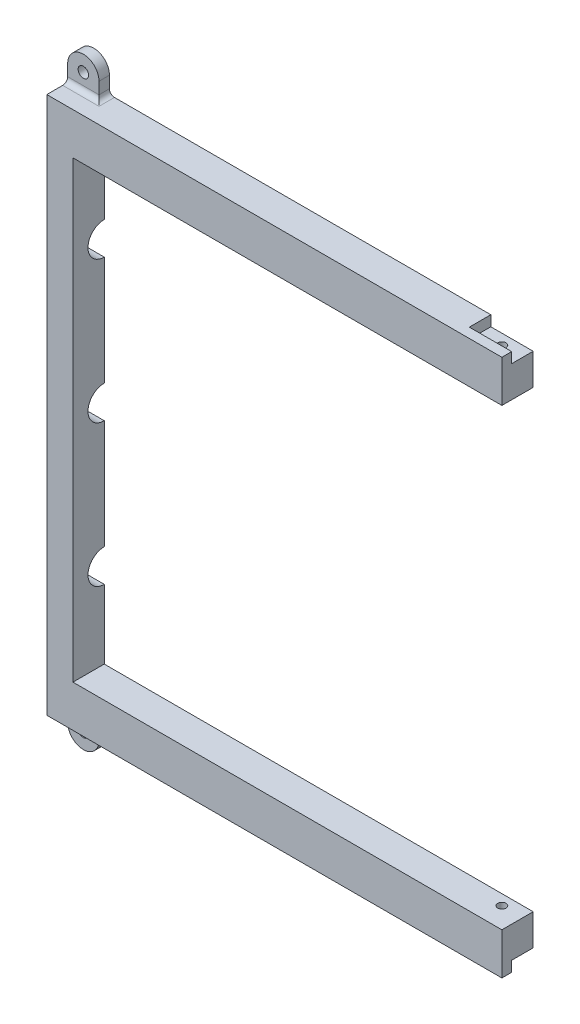
ISO-10303-21;
HEADER;
FILE_DESCRIPTION(('STEP AP214'),'2;1');
FILE_NAME('part.step','',(''),(''),'','','');
FILE_SCHEMA(('AUTOMOTIVE_DESIGN { 1 0 10303 214 1 1 1 1 }'));
ENDSEC;
DATA;
#1=APPLICATION_CONTEXT('core data for automotive mechanical design processes');
#2=APPLICATION_PROTOCOL_DEFINITION('international standard','automotive_design',2000,#1);
#3=PRODUCT_CONTEXT('',#1,'mechanical');
#4=PRODUCT('Part','Part','',(#3));
#5=PRODUCT_RELATED_PRODUCT_CATEGORY('part','',(#4));
#6=PRODUCT_DEFINITION_FORMATION('','',#4);
#7=PRODUCT_DEFINITION_CONTEXT('part definition',#1,'design');
#8=PRODUCT_DEFINITION('design','',#6,#7);
#9=PRODUCT_DEFINITION_SHAPE('','',#8);
#10=(LENGTH_UNIT() NAMED_UNIT(*) SI_UNIT(.MILLI.,.METRE.));
#11=(NAMED_UNIT(*) PLANE_ANGLE_UNIT() SI_UNIT($,.RADIAN.));
#12=(NAMED_UNIT(*) SI_UNIT($,.STERADIAN.) SOLID_ANGLE_UNIT());
#13=UNCERTAINTY_MEASURE_WITH_UNIT(LENGTH_MEASURE(1.E-05),#10,'distance_accuracy_value','');
#14=(GEOMETRIC_REPRESENTATION_CONTEXT(3) GLOBAL_UNCERTAINTY_ASSIGNED_CONTEXT((#13)) GLOBAL_UNIT_ASSIGNED_CONTEXT((#10,
#11,#12)) REPRESENTATION_CONTEXT('',''));
#15=CARTESIAN_POINT('',(0.,0.,0.));
#16=DIRECTION('',(0.,0.,1.));
#17=DIRECTION('',(1.,0.,0.));
#18=AXIS2_PLACEMENT_3D('',#15,#16,#17);
#19=CARTESIAN_POINT('',(-138.43,-81.7626,9.525));
#20=DIRECTION('',(0.,1.,0.));
#21=DIRECTION('',(0.,0.,1.));
#22=AXIS2_PLACEMENT_3D('',#19,#20,#21);
#23=PLANE('',#22);
#24=DIRECTION('',(1.,0.,0.));
#25=VECTOR('',#24,1.);
#26=CARTESIAN_POINT('',(-12.8905,-81.7626,6.5405));
#27=LINE('',#26,#25);
#28=CARTESIAN_POINT('',(-12.8905,-81.7626,6.5405));
#29=VERTEX_POINT('',#28);
#30=CARTESIAN_POINT('',(0.,-81.7626,6.5405));
#31=VERTEX_POINT('',#30);
#32=EDGE_CURVE('E462',#29,#31,#27,.T.);
#33=ORIENTED_EDGE('',*,*,#32,.T.);
#34=DIRECTION('',(0.,0.,1.));
#35=VECTOR('',#34,1.);
#36=CARTESIAN_POINT('',(0.,-81.7626,9.525));
#37=LINE('',#36,#35);
#38=CARTESIAN_POINT('',(0.,-81.7626,9.525));
#39=VERTEX_POINT('',#38);
#40=EDGE_CURVE('E446',#31,#39,#37,.T.);
#41=ORIENTED_EDGE('',*,*,#40,.T.);
#42=DIRECTION('',(1.,0.,0.));
#43=VECTOR('',#42,1.);
#44=CARTESIAN_POINT('',(-138.43,-81.7626,9.525));
#45=LINE('',#44,#43);
#46=CARTESIAN_POINT('',(-138.43,-81.7626,9.525));
#47=VERTEX_POINT('',#46);
#48=EDGE_CURVE('E274',#47,#39,#45,.T.);
#49=ORIENTED_EDGE('',*,*,#48,.F.);
#50=DIRECTION('',(0.,0.,-1.));
#51=VECTOR('',#50,1.);
#52=CARTESIAN_POINT('',(-138.43,-81.7626,9.525));
#53=LINE('',#52,#51);
#54=CARTESIAN_POINT('',(-138.43,-81.7626,4.699));
#55=VERTEX_POINT('',#54);
#56=EDGE_CURVE('E291',#47,#55,#53,.T.);
#57=ORIENTED_EDGE('',*,*,#56,.T.);
#58=DIRECTION('',(1.,0.,0.));
#59=VECTOR('',#58,1.);
#60=CARTESIAN_POINT('',(-138.43,-81.7626,4.699));
#61=LINE('',#60,#59);
#62=CARTESIAN_POINT('',(-127.381,-81.7626,4.699));
#63=VERTEX_POINT('',#62);
#64=EDGE_CURVE('E307',#55,#63,#61,.T.);
#65=ORIENTED_EDGE('',*,*,#64,.T.);
#66=DIRECTION('',(0.,0.,-1.));
#67=VECTOR('',#66,1.);
#68=CARTESIAN_POINT('',(-127.381,-81.7626,9.525));
#69=LINE('',#68,#67);
#70=CARTESIAN_POINT('',(-127.381,-81.7626,0.));
#71=VERTEX_POINT('',#70);
#72=EDGE_CURVE('E309',#63,#71,#69,.T.);
#73=ORIENTED_EDGE('',*,*,#72,.T.);
#74=DIRECTION('',(1.,0.,0.));
#75=VECTOR('',#74,1.);
#76=CARTESIAN_POINT('',(-138.43,-81.7626,0.));
#77=LINE('',#76,#75);
#78=CARTESIAN_POINT('',(-12.8905,-81.7626,0.));
#79=VERTEX_POINT('',#78);
#80=EDGE_CURVE('E284',#71,#79,#77,.T.);
#81=ORIENTED_EDGE('',*,*,#80,.T.);
#82=DIRECTION('',(0.,0.,1.));
#83=VECTOR('',#82,1.);
#84=CARTESIAN_POINT('',(-12.8905,-81.7626,6.5405));
#85=LINE('',#84,#83);
#86=EDGE_CURVE('E353',#79,#29,#85,.T.);
#87=ORIENTED_EDGE('',*,*,#86,.T.);
#88=EDGE_LOOP('',(#33,#41,#49,#57,#65,#73,#81,#87));
#89=FACE_BOUND('',#88,.T.);
#90=ADVANCED_FACE('F35',(#89),#23,.F.);
#91=CARTESIAN_POINT('',(0.,0.,0.));
#92=DIRECTION('',(0.,0.,-1.));
#93=DIRECTION('',(-1.,0.,0.));
#94=AXIS2_PLACEMENT_3D('',#91,#92,#93);
#95=PLANE('',#94);
#96=DIRECTION('',(0.,-1.,0.));
#97=VECTOR('',#96,1.);
#98=CARTESIAN_POINT('',(0.,103.000167651619,0.));
#99=LINE('',#98,#97);
#100=CARTESIAN_POINT('',(0.,-69.0626,0.));
#101=VERTEX_POINT('',#100);
#102=CARTESIAN_POINT('',(0.,-78.5876,0.));
#103=VERTEX_POINT('',#102);
#104=EDGE_CURVE('E242',#101,#103,#99,.T.);
#105=ORIENTED_EDGE('',*,*,#104,.T.);
#106=DIRECTION('',(1.,0.,0.));
#107=VECTOR('',#106,1.);
#108=CARTESIAN_POINT('',(0.,-78.5876,0.));
#109=LINE('',#108,#107);
#110=CARTESIAN_POINT('',(-12.8905,-78.5876,0.));
#111=VERTEX_POINT('',#110);
#112=EDGE_CURVE('E339',#111,#103,#109,.T.);
#113=ORIENTED_EDGE('',*,*,#112,.F.);
#114=DIRECTION('',(0.,-1.,0.));
#115=VECTOR('',#114,1.);
#116=CARTESIAN_POINT('',(-12.8905,0.,0.));
#117=LINE('',#116,#115);
#118=EDGE_CURVE('E43',#111,#79,#117,.T.);
#119=ORIENTED_EDGE('',*,*,#118,.T.);
#120=ORIENTED_EDGE('',*,*,#80,.F.);
#121=CARTESIAN_POINT('',(-127.381,-83.2866,0.));
#122=DIRECTION('',(0.,0.,-1.));
#123=DIRECTION('',(-1.,0.,0.));
#124=AXIS2_PLACEMENT_3D('',#121,#122,#123);
#125=CIRCLE('',#124,1.524);
#126=CARTESIAN_POINT('',(-128.905,-83.2866,0.));
#127=VERTEX_POINT('',#126);
#128=EDGE_CURVE('E321',#71,#127,#125,.F.);
#129=ORIENTED_EDGE('',*,*,#128,.T.);
#130=DIRECTION('',(0.,-1.,0.));
#131=VECTOR('',#130,1.);
#132=CARTESIAN_POINT('',(-128.905,-81.7626,0.));
#133=LINE('',#132,#131);
#134=CARTESIAN_POINT('',(-128.905,-86.8426,0.));
#135=VERTEX_POINT('',#134);
#136=EDGE_CURVE('E362',#127,#135,#133,.T.);
#137=ORIENTED_EDGE('',*,*,#136,.T.);
#138=CARTESIAN_POINT('',(-133.6675,-86.8426,0.));
#139=DIRECTION('',(0.,0.,-1.));
#140=DIRECTION('',(-1.,0.,0.));
#141=AXIS2_PLACEMENT_3D('',#138,#139,#140);
#142=CIRCLE('',#141,4.7625);
#143=CARTESIAN_POINT('',(-138.43,-86.8426,0.));
#144=VERTEX_POINT('',#143);
#145=EDGE_CURVE('E370',#135,#144,#142,.T.);
#146=ORIENTED_EDGE('',*,*,#145,.T.);
#147=DIRECTION('',(0.,-1.,0.));
#148=VECTOR('',#147,1.);
#149=CARTESIAN_POINT('',(-138.43,-81.7626,0.));
#150=LINE('',#149,#148);
#151=CARTESIAN_POINT('',(-138.43,-48.0568,0.));
#152=VERTEX_POINT('',#151);
#153=EDGE_CURVE('E270',#152,#144,#150,.T.);
#154=ORIENTED_EDGE('',*,*,#153,.F.);
#155=DIRECTION('',(1.,0.,0.));
#156=VECTOR('',#155,1.);
#157=CARTESIAN_POINT('',(-138.43,-48.0568,0.));
#158=LINE('',#157,#156);
#159=CARTESIAN_POINT('',(-130.4798,-48.0568,0.));
#160=VERTEX_POINT('',#159);
#161=EDGE_CURVE('E255',#160,#152,#158,.F.);
#162=ORIENTED_EDGE('',*,*,#161,.F.);
#163=DIRECTION('',(0.,-1.,0.));
#164=VECTOR('',#163,1.);
#165=CARTESIAN_POINT('',(-130.4798,-69.0626,0.));
#166=LINE('',#165,#164);
#167=CARTESIAN_POINT('',(-130.4798,-69.0626,0.));
#168=VERTEX_POINT('',#167);
#169=EDGE_CURVE('E249',#160,#168,#166,.T.);
#170=ORIENTED_EDGE('',*,*,#169,.T.);
#171=DIRECTION('',(1.,0.,0.));
#172=VECTOR('',#171,1.);
#173=CARTESIAN_POINT('',(-130.4798,-69.0626,0.));
#174=LINE('',#173,#172);
#175=EDGE_CURVE('E261',#168,#101,#174,.T.);
#176=ORIENTED_EDGE('',*,*,#175,.T.);
#177=EDGE_LOOP('',(#105,#113,#119,#120,#129,#137,#146,#154,#162,#170,#176));
#178=FACE_BOUND('',#177,.T.);
#179=CARTESIAN_POINT('',(-133.6675,-86.8426,0.));
#180=DIRECTION('',(0.,0.,-1.));
#181=DIRECTION('',(1.,0.,0.));
#182=AXIS2_PLACEMENT_3D('',#179,#180,#181);
#183=CIRCLE('',#182,1.58749999999999);
#184=CARTESIAN_POINT('',(-132.08,-86.8426,0.));
#185=VERTEX_POINT('',#184);
#186=EDGE_CURVE('E331',#185,#185,#183,.T.);
#187=ORIENTED_EDGE('',*,*,#186,.F.);
#188=EDGE_LOOP('',(#187));
#189=FACE_BOUND('',#188,.T.);
#190=ADVANCED_FACE('F347',(#178,#189),#95,.T.);
#191=DIRECTION('',(1.,0.,0.));
#192=VECTOR('',#191,1.);
#193=CARTESIAN_POINT('',(-138.43,-38.1508,0.));
#194=LINE('',#193,#192);
#195=CARTESIAN_POINT('',(-138.43,-38.1508,0.));
#196=VERTEX_POINT('',#195);
#197=CARTESIAN_POINT('',(-130.4798,-38.1508,0.));
#198=VERTEX_POINT('',#197);
#199=EDGE_CURVE('E250',#196,#198,#194,.T.);
#200=ORIENTED_EDGE('',*,*,#199,.F.);
#201=CARTESIAN_POINT('',(-138.43,-4.953,0.));
#202=VERTEX_POINT('',#201);
#203=EDGE_CURVE('E511',#202,#196,#150,.T.);
#204=ORIENTED_EDGE('',*,*,#203,.F.);
#205=DIRECTION('',(1.,0.,0.));
#206=VECTOR('',#205,1.);
#207=CARTESIAN_POINT('',(-138.43,-4.953,0.));
#208=LINE('',#207,#206);
#209=CARTESIAN_POINT('',(-130.4798,-4.953,0.));
#210=VERTEX_POINT('',#209);
#211=EDGE_CURVE('E418',#210,#202,#208,.F.);
#212=ORIENTED_EDGE('',*,*,#211,.F.);
#213=EDGE_CURVE('E252',#210,#198,#166,.T.);
#214=ORIENTED_EDGE('',*,*,#213,.T.);
#215=EDGE_LOOP('',(#200,#204,#212,#214));
#216=FACE_BOUND('',#215,.T.);
#217=ADVANCED_FACE('F532',(#216),#95,.T.);
#218=CARTESIAN_POINT('',(0.,78.5876,0.));
#219=VERTEX_POINT('',#218);
#220=CARTESIAN_POINT('',(0.,69.0626,0.));
#221=VERTEX_POINT('',#220);
#222=EDGE_CURVE('E50',#219,#221,#99,.T.);
#223=ORIENTED_EDGE('',*,*,#222,.T.);
#224=DIRECTION('',(-1.,0.,0.));
#225=VECTOR('',#224,1.);
#226=CARTESIAN_POINT('',(-130.4798,69.0626,0.));
#227=LINE('',#226,#225);
#228=CARTESIAN_POINT('',(-130.4798,69.0626,0.));
#229=VERTEX_POINT('',#228);
#230=EDGE_CURVE('E238',#221,#229,#227,.T.);
#231=ORIENTED_EDGE('',*,*,#230,.T.);
#232=CARTESIAN_POINT('',(-130.4798,48.0568,0.));
#233=VERTEX_POINT('',#232);
#234=EDGE_CURVE('E254',#229,#233,#166,.T.);
#235=ORIENTED_EDGE('',*,*,#234,.T.);
#236=DIRECTION('',(1.,0.,0.));
#237=VECTOR('',#236,1.);
#238=CARTESIAN_POINT('',(-138.43,48.0568,0.));
#239=LINE('',#238,#237);
#240=CARTESIAN_POINT('',(-138.43,48.0568,0.));
#241=VERTEX_POINT('',#240);
#242=EDGE_CURVE('E424',#241,#233,#239,.T.);
#243=ORIENTED_EDGE('',*,*,#242,.F.);
#244=CARTESIAN_POINT('',(-138.43,86.8426,0.));
#245=VERTEX_POINT('',#244);
#246=EDGE_CURVE('E281',#245,#241,#150,.T.);
#247=ORIENTED_EDGE('',*,*,#246,.F.);
#248=CARTESIAN_POINT('',(-133.6675,86.8426,0.));
#249=DIRECTION('',(0.,0.,1.));
#250=DIRECTION('',(-1.,0.,0.));
#251=AXIS2_PLACEMENT_3D('',#248,#249,#250);
#252=CIRCLE('',#251,4.7625);
#253=CARTESIAN_POINT('',(-128.905,86.8426,0.));
#254=VERTEX_POINT('',#253);
#255=EDGE_CURVE('E389',#254,#245,#252,.T.);
#256=ORIENTED_EDGE('',*,*,#255,.F.);
#257=DIRECTION('',(0.,1.,0.));
#258=VECTOR('',#257,1.);
#259=CARTESIAN_POINT('',(-128.905,81.7626,0.));
#260=LINE('',#259,#258);
#261=CARTESIAN_POINT('',(-128.905,83.2866,0.));
#262=VERTEX_POINT('',#261);
#263=EDGE_CURVE('E396',#262,#254,#260,.T.);
#264=ORIENTED_EDGE('',*,*,#263,.F.);
#265=CARTESIAN_POINT('',(-127.381,83.2866,0.));
#266=DIRECTION('',(0.,0.,-1.));
#267=DIRECTION('',(-1.,0.,0.));
#268=AXIS2_PLACEMENT_3D('',#265,#266,#267);
#269=CIRCLE('',#268,1.524);
#270=CARTESIAN_POINT('',(-127.381,81.7626,0.));
#271=VERTEX_POINT('',#270);
#272=EDGE_CURVE('E318',#262,#271,#269,.F.);
#273=ORIENTED_EDGE('',*,*,#272,.T.);
#274=DIRECTION('',(-1.,0.,0.));
#275=VECTOR('',#274,1.);
#276=CARTESIAN_POINT('',(-138.43,81.7626,0.));
#277=LINE('',#276,#275);
#278=CARTESIAN_POINT('',(-12.8905,81.7626,0.));
#279=VERTEX_POINT('',#278);
#280=EDGE_CURVE('E275',#279,#271,#277,.T.);
#281=ORIENTED_EDGE('',*,*,#280,.F.);
#282=DIRECTION('',(0.,1.,0.));
#283=VECTOR('',#282,1.);
#284=CARTESIAN_POINT('',(-12.8905,0.,0.));
#285=LINE('',#284,#283);
#286=CARTESIAN_POINT('',(-12.8905,78.5876,0.));
#287=VERTEX_POINT('',#286);
#288=EDGE_CURVE('E335',#287,#279,#285,.T.);
#289=ORIENTED_EDGE('',*,*,#288,.F.);
#290=DIRECTION('',(-1.,0.,0.));
#291=VECTOR('',#290,1.);
#292=CARTESIAN_POINT('',(0.,78.5876,0.));
#293=LINE('',#292,#291);
#294=EDGE_CURVE('E241',#219,#287,#293,.T.);
#295=ORIENTED_EDGE('',*,*,#294,.F.);
#296=EDGE_LOOP('',(#223,#231,#235,#243,#247,#256,#264,#273,#281,#289,#295));
#297=FACE_BOUND('',#296,.T.);
#298=CARTESIAN_POINT('',(-133.6675,86.8426,0.));
#299=DIRECTION('',(0.,0.,1.));
#300=DIRECTION('',(1.,0.,0.));
#301=AXIS2_PLACEMENT_3D('',#298,#299,#300);
#302=CIRCLE('',#301,1.58749999999999);
#303=CARTESIAN_POINT('',(-132.08,86.8426,0.));
#304=VERTEX_POINT('',#303);
#305=EDGE_CURVE('E384',#304,#304,#302,.T.);
#306=ORIENTED_EDGE('',*,*,#305,.T.);
#307=EDGE_LOOP('',(#306));
#308=FACE_BOUND('',#307,.T.);
#309=ADVANCED_FACE('F235',(#297,#308),#95,.T.);
#310=DIRECTION('',(1.,0.,0.));
#311=VECTOR('',#310,1.);
#312=CARTESIAN_POINT('',(-138.43,38.1508,0.));
#313=LINE('',#312,#311);
#314=CARTESIAN_POINT('',(-130.4798,38.1508,0.));
#315=VERTEX_POINT('',#314);
#316=CARTESIAN_POINT('',(-138.43,38.1508,0.));
#317=VERTEX_POINT('',#316);
#318=EDGE_CURVE('E422',#315,#317,#313,.F.);
#319=ORIENTED_EDGE('',*,*,#318,.F.);
#320=CARTESIAN_POINT('',(-130.4798,4.953,0.));
#321=VERTEX_POINT('',#320);
#322=EDGE_CURVE('E262',#315,#321,#166,.T.);
#323=ORIENTED_EDGE('',*,*,#322,.T.);
#324=DIRECTION('',(1.,0.,0.));
#325=VECTOR('',#324,1.);
#326=CARTESIAN_POINT('',(-138.43,4.953,0.));
#327=LINE('',#326,#325);
#328=CARTESIAN_POINT('',(-138.43,4.953,0.));
#329=VERTEX_POINT('',#328);
#330=EDGE_CURVE('E420',#329,#321,#327,.T.);
#331=ORIENTED_EDGE('',*,*,#330,.F.);
#332=EDGE_CURVE('E285',#317,#329,#150,.T.);
#333=ORIENTED_EDGE('',*,*,#332,.F.);
#334=EDGE_LOOP('',(#319,#323,#331,#333));
#335=FACE_BOUND('',#334,.T.);
#336=ADVANCED_FACE('F518',(#335),#95,.T.);
#337=CARTESIAN_POINT('',(0.,0.,9.525));
#338=DIRECTION('',(0.,0.,-1.));
#339=DIRECTION('',(-1.,0.,0.));
#340=AXIS2_PLACEMENT_3D('',#337,#338,#339);
#341=PLANE('',#340);
#342=ORIENTED_EDGE('',*,*,#48,.T.);
#343=DIRECTION('',(0.,-1.,0.));
#344=VECTOR('',#343,1.);
#345=CARTESIAN_POINT('',(0.,0.,9.525));
#346=LINE('',#345,#344);
#347=CARTESIAN_POINT('',(0.,-69.0626,9.525));
#348=VERTEX_POINT('',#347);
#349=EDGE_CURVE('E441',#348,#39,#346,.T.);
#350=ORIENTED_EDGE('',*,*,#349,.F.);
#351=DIRECTION('',(1.,0.,0.));
#352=VECTOR('',#351,1.);
#353=CARTESIAN_POINT('',(-130.4798,-69.0626,9.525));
#354=LINE('',#353,#352);
#355=CARTESIAN_POINT('',(-130.4798,-69.0626,9.525));
#356=VERTEX_POINT('',#355);
#357=EDGE_CURVE('E258',#356,#348,#354,.T.);
#358=ORIENTED_EDGE('',*,*,#357,.F.);
#359=DIRECTION('',(0.,-1.,0.));
#360=VECTOR('',#359,1.);
#361=CARTESIAN_POINT('',(-130.4798,-69.0626,9.525));
#362=LINE('',#361,#360);
#363=CARTESIAN_POINT('',(-130.4798,69.0626,9.525));
#364=VERTEX_POINT('',#363);
#365=EDGE_CURVE('E427',#364,#356,#362,.T.);
#366=ORIENTED_EDGE('',*,*,#365,.F.);
#367=DIRECTION('',(-1.,0.,0.));
#368=VECTOR('',#367,1.);
#369=CARTESIAN_POINT('',(-130.4798,69.0626,9.525));
#370=LINE('',#369,#368);
#371=CARTESIAN_POINT('',(0.,69.0626,9.525));
#372=VERTEX_POINT('',#371);
#373=EDGE_CURVE('E265',#372,#364,#370,.T.);
#374=ORIENTED_EDGE('',*,*,#373,.F.);
#375=CARTESIAN_POINT('',(0.,81.7626,9.525));
#376=VERTEX_POINT('',#375);
#377=EDGE_CURVE('E226',#376,#372,#346,.T.);
#378=ORIENTED_EDGE('',*,*,#377,.F.);
#379=DIRECTION('',(-1.,0.,0.));
#380=VECTOR('',#379,1.);
#381=CARTESIAN_POINT('',(-138.43,81.7626,9.525));
#382=LINE('',#381,#380);
#383=CARTESIAN_POINT('',(-138.43,81.7626,9.525));
#384=VERTEX_POINT('',#383);
#385=EDGE_CURVE('E278',#376,#384,#382,.T.);
#386=ORIENTED_EDGE('',*,*,#385,.T.);
#387=DIRECTION('',(0.,-1.,0.));
#388=VECTOR('',#387,1.);
#389=CARTESIAN_POINT('',(-138.43,-81.7626,9.525));
#390=LINE('',#389,#388);
#391=EDGE_CURVE('E271',#384,#47,#390,.T.);
#392=ORIENTED_EDGE('',*,*,#391,.T.);
#393=EDGE_LOOP('',(#342,#350,#358,#366,#374,#378,#386,#392));
#394=FACE_BOUND('',#393,.T.);
#395=ADVANCED_FACE('F440',(#394),#341,.F.);
#396=CARTESIAN_POINT('',(-138.43,-81.7626,9.525));
#397=DIRECTION('',(1.,0.,0.));
#398=DIRECTION('',(0.,0.,-1.));
#399=AXIS2_PLACEMENT_3D('',#396,#397,#398);
#400=PLANE('',#399);
#401=ORIENTED_EDGE('',*,*,#203,.T.);
#402=CARTESIAN_POINT('',(-138.43,-43.1038,0.));
#403=DIRECTION('',(1.,0.,0.));
#404=DIRECTION('',(0.,0.,-1.));
#405=AXIS2_PLACEMENT_3D('',#402,#403,#404);
#406=CIRCLE('',#405,4.953);
#407=EDGE_CURVE('E407',#196,#152,#406,.T.);
#408=ORIENTED_EDGE('',*,*,#407,.T.);
#409=ORIENTED_EDGE('',*,*,#153,.T.);
#410=DIRECTION('',(0.,0.,-1.));
#411=VECTOR('',#410,1.);
#412=CARTESIAN_POINT('',(-138.43,-86.8426,3.175));
#413=LINE('',#412,#411);
#414=CARTESIAN_POINT('',(-138.43,-86.8426,3.175));
#415=VERTEX_POINT('',#414);
#416=EDGE_CURVE('E381',#415,#144,#413,.T.);
#417=ORIENTED_EDGE('',*,*,#416,.F.);
#418=DIRECTION('',(0.,1.,0.));
#419=VECTOR('',#418,1.);
#420=CARTESIAN_POINT('',(-138.43,-81.7626,3.175));
#421=LINE('',#420,#419);
#422=CARTESIAN_POINT('',(-138.43,-83.2866,3.175));
#423=VERTEX_POINT('',#422);
#424=EDGE_CURVE('E378',#415,#423,#421,.T.);
#425=ORIENTED_EDGE('',*,*,#424,.T.);
#426=CARTESIAN_POINT('',(-138.43,-83.2866,4.699));
#427=DIRECTION('',(1.,0.,0.));
#428=DIRECTION('',(0.,0.,-1.));
#429=AXIS2_PLACEMENT_3D('',#426,#427,#428);
#430=CIRCLE('',#429,1.524);
#431=EDGE_CURVE('E323',#423,#55,#430,.T.);
#432=ORIENTED_EDGE('',*,*,#431,.T.);
#433=ORIENTED_EDGE('',*,*,#56,.F.);
#434=ORIENTED_EDGE('',*,*,#391,.F.);
#435=DIRECTION('',(0.,0.,-1.));
#436=VECTOR('',#435,1.);
#437=CARTESIAN_POINT('',(-138.43,81.7626,9.525));
#438=LINE('',#437,#436);
#439=CARTESIAN_POINT('',(-138.43,81.7626,4.699));
#440=VERTEX_POINT('',#439);
#441=EDGE_CURVE('E280',#384,#440,#438,.T.);
#442=ORIENTED_EDGE('',*,*,#441,.T.);
#443=CARTESIAN_POINT('',(-138.43,83.2866,4.699));
#444=DIRECTION('',(1.,0.,0.));
#445=DIRECTION('',(0.,0.,-1.));
#446=AXIS2_PLACEMENT_3D('',#443,#444,#445);
#447=CIRCLE('',#446,1.524);
#448=CARTESIAN_POINT('',(-138.43,83.2866,3.175));
#449=VERTEX_POINT('',#448);
#450=EDGE_CURVE('E325',#440,#449,#447,.T.);
#451=ORIENTED_EDGE('',*,*,#450,.T.);
#452=DIRECTION('',(0.,-1.,0.));
#453=VECTOR('',#452,1.);
#454=CARTESIAN_POINT('',(-138.43,81.7626,3.175));
#455=LINE('',#454,#453);
#456=CARTESIAN_POINT('',(-138.43,86.8426,3.175));
#457=VERTEX_POINT('',#456);
#458=EDGE_CURVE('E392',#457,#449,#455,.T.);
#459=ORIENTED_EDGE('',*,*,#458,.F.);
#460=DIRECTION('',(0.,0.,-1.));
#461=VECTOR('',#460,1.);
#462=CARTESIAN_POINT('',(-138.43,86.8426,3.175));
#463=LINE('',#462,#461);
#464=EDGE_CURVE('E400',#457,#245,#463,.T.);
#465=ORIENTED_EDGE('',*,*,#464,.T.);
#466=ORIENTED_EDGE('',*,*,#246,.T.);
#467=CARTESIAN_POINT('',(-138.43,43.1038,0.));
#468=DIRECTION('',(1.,0.,0.));
#469=DIRECTION('',(0.,0.,-1.));
#470=AXIS2_PLACEMENT_3D('',#467,#468,#469);
#471=CIRCLE('',#470,4.953);
#472=EDGE_CURVE('E410',#241,#317,#471,.T.);
#473=ORIENTED_EDGE('',*,*,#472,.T.);
#474=ORIENTED_EDGE('',*,*,#332,.T.);
#475=CARTESIAN_POINT('',(-138.43,0.,0.));
#476=DIRECTION('',(1.,0.,0.));
#477=DIRECTION('',(0.,0.,-1.));
#478=AXIS2_PLACEMENT_3D('',#475,#476,#477);
#479=CIRCLE('',#478,4.953);
#480=EDGE_CURVE('E413',#329,#202,#479,.T.);
#481=ORIENTED_EDGE('',*,*,#480,.T.);
#482=EDGE_LOOP('',(#401,#408,#409,#417,#425,#432,#433,#434,#442,#451,#459,#465,#466,#473,#474,#481));
#483=FACE_BOUND('',#482,.T.);
#484=ADVANCED_FACE('F501',(#483),#400,.F.);
#485=CARTESIAN_POINT('',(-138.43,81.7626,9.525));
#486=DIRECTION('',(0.,-1.,0.));
#487=DIRECTION('',(0.,0.,-1.));
#488=AXIS2_PLACEMENT_3D('',#485,#486,#487);
#489=PLANE('',#488);
#490=ORIENTED_EDGE('',*,*,#385,.F.);
#491=DIRECTION('',(0.,0.,-1.));
#492=VECTOR('',#491,1.);
#493=CARTESIAN_POINT('',(0.,81.7626,9.525));
#494=LINE('',#493,#492);
#495=CARTESIAN_POINT('',(0.,81.7626,6.5405));
#496=VERTEX_POINT('',#495);
#497=EDGE_CURVE('E453',#376,#496,#494,.T.);
#498=ORIENTED_EDGE('',*,*,#497,.T.);
#499=DIRECTION('',(1.,0.,0.));
#500=VECTOR('',#499,1.);
#501=CARTESIAN_POINT('',(-12.8905,81.7626,6.5405));
#502=LINE('',#501,#500);
#503=CARTESIAN_POINT('',(-12.8905,81.7626,6.5405));
#504=VERTEX_POINT('',#503);
#505=EDGE_CURVE('E478',#504,#496,#502,.T.);
#506=ORIENTED_EDGE('',*,*,#505,.F.);
#507=DIRECTION('',(0.,0.,-1.));
#508=VECTOR('',#507,1.);
#509=CARTESIAN_POINT('',(-12.8905,81.7626,9.525));
#510=LINE('',#509,#508);
#511=EDGE_CURVE('E327',#504,#279,#510,.T.);
#512=ORIENTED_EDGE('',*,*,#511,.T.);
#513=ORIENTED_EDGE('',*,*,#280,.T.);
#514=DIRECTION('',(0.,0.,-1.));
#515=VECTOR('',#514,1.);
#516=CARTESIAN_POINT('',(-127.381,81.7626,3.175));
#517=LINE('',#516,#515);
#518=CARTESIAN_POINT('',(-127.381,81.7626,4.699));
#519=VERTEX_POINT('',#518);
#520=EDGE_CURVE('E302',#271,#519,#517,.F.);
#521=ORIENTED_EDGE('',*,*,#520,.T.);
#522=DIRECTION('',(1.,0.,0.));
#523=VECTOR('',#522,1.);
#524=CARTESIAN_POINT('',(-138.43,81.7626,4.699));
#525=LINE('',#524,#523);
#526=EDGE_CURVE('E300',#519,#440,#525,.F.);
#527=ORIENTED_EDGE('',*,*,#526,.T.);
#528=ORIENTED_EDGE('',*,*,#441,.F.);
#529=EDGE_LOOP('',(#490,#498,#506,#512,#513,#521,#527,#528));
#530=FACE_BOUND('',#529,.T.);
#531=ADVANCED_FACE('F557',(#530),#489,.F.);
#532=CARTESIAN_POINT('',(-130.4798,69.0626,9.525));
#533=DIRECTION('',(0.,-1.,0.));
#534=DIRECTION('',(0.,0.,-1.));
#535=AXIS2_PLACEMENT_3D('',#532,#533,#534);
#536=PLANE('',#535);
#537=DIRECTION('',(0.,0.,-1.));
#538=VECTOR('',#537,1.);
#539=CARTESIAN_POINT('',(0.,69.0626,9.525));
#540=LINE('',#539,#538);
#541=EDGE_CURVE('E223',#372,#221,#540,.T.);
#542=ORIENTED_EDGE('',*,*,#541,.F.);
#543=ORIENTED_EDGE('',*,*,#373,.T.);
#544=DIRECTION('',(0.,0.,-1.));
#545=VECTOR('',#544,1.);
#546=CARTESIAN_POINT('',(-130.4798,69.0626,9.525));
#547=LINE('',#546,#545);
#548=EDGE_CURVE('E247',#364,#229,#547,.T.);
#549=ORIENTED_EDGE('',*,*,#548,.T.);
#550=ORIENTED_EDGE('',*,*,#230,.F.);
#551=EDGE_LOOP('',(#542,#543,#549,#550));
#552=FACE_BOUND('',#551,.T.);
#553=CARTESIAN_POINT('',(-6.35,69.0626,3.175));
#554=DIRECTION('',(0.,-1.,0.));
#555=DIRECTION('',(0.,0.,-1.));
#556=AXIS2_PLACEMENT_3D('',#553,#554,#555);
#557=CIRCLE('',#556,1.27);
#558=CARTESIAN_POINT('',(-6.35,69.0626,1.905));
#559=VERTEX_POINT('',#558);
#560=EDGE_CURVE('E472',#559,#559,#557,.F.);
#561=ORIENTED_EDGE('',*,*,#560,.T.);
#562=EDGE_LOOP('',(#561));
#563=FACE_BOUND('',#562,.T.);
#564=ADVANCED_FACE('F244',(#552,#563),#536,.T.);
#565=CARTESIAN_POINT('',(-130.4798,-69.0626,9.525));
#566=DIRECTION('',(1.,0.,0.));
#567=DIRECTION('',(0.,0.,-1.));
#568=AXIS2_PLACEMENT_3D('',#565,#566,#567);
#569=PLANE('',#568);
#570=CARTESIAN_POINT('',(-130.4798,-43.1038,0.));
#571=DIRECTION('',(1.,0.,0.));
#572=DIRECTION('',(0.,0.,-1.));
#573=AXIS2_PLACEMENT_3D('',#570,#571,#572);
#574=CIRCLE('',#573,4.953);
#575=EDGE_CURVE('E298',#198,#160,#574,.T.);
#576=ORIENTED_EDGE('',*,*,#575,.F.);
#577=ORIENTED_EDGE('',*,*,#213,.F.);
#578=CARTESIAN_POINT('',(-130.4798,0.,0.));
#579=DIRECTION('',(1.,0.,0.));
#580=DIRECTION('',(0.,0.,-1.));
#581=AXIS2_PLACEMENT_3D('',#578,#579,#580);
#582=CIRCLE('',#581,4.953);
#583=EDGE_CURVE('E294',#321,#210,#582,.T.);
#584=ORIENTED_EDGE('',*,*,#583,.F.);
#585=ORIENTED_EDGE('',*,*,#322,.F.);
#586=CARTESIAN_POINT('',(-130.4798,43.1038,0.));
#587=DIRECTION('',(1.,0.,0.));
#588=DIRECTION('',(0.,0.,-1.));
#589=AXIS2_PLACEMENT_3D('',#586,#587,#588);
#590=CIRCLE('',#589,4.953);
#591=EDGE_CURVE('E296',#233,#315,#590,.T.);
#592=ORIENTED_EDGE('',*,*,#591,.F.);
#593=ORIENTED_EDGE('',*,*,#234,.F.);
#594=ORIENTED_EDGE('',*,*,#548,.F.);
#595=ORIENTED_EDGE('',*,*,#365,.T.);
#596=DIRECTION('',(0.,0.,-1.));
#597=VECTOR('',#596,1.);
#598=CARTESIAN_POINT('',(-130.4798,-69.0626,9.525));
#599=LINE('',#598,#597);
#600=EDGE_CURVE('E266',#356,#168,#599,.T.);
#601=ORIENTED_EDGE('',*,*,#600,.T.);
#602=ORIENTED_EDGE('',*,*,#169,.F.);
#603=EDGE_LOOP('',(#576,#577,#584,#585,#592,#593,#594,#595,#601,#602));
#604=FACE_BOUND('',#603,.T.);
#605=ADVANCED_FACE('F527',(#604),#569,.T.);
#606=CARTESIAN_POINT('',(-130.4798,-69.0626,9.525));
#607=DIRECTION('',(0.,1.,0.));
#608=DIRECTION('',(0.,0.,1.));
#609=AXIS2_PLACEMENT_3D('',#606,#607,#608);
#610=PLANE('',#609);
#611=DIRECTION('',(0.,0.,1.));
#612=VECTOR('',#611,1.);
#613=CARTESIAN_POINT('',(0.,-69.0626,9.525));
#614=LINE('',#613,#612);
#615=EDGE_CURVE('E231',#101,#348,#614,.T.);
#616=ORIENTED_EDGE('',*,*,#615,.F.);
#617=ORIENTED_EDGE('',*,*,#175,.F.);
#618=ORIENTED_EDGE('',*,*,#600,.F.);
#619=ORIENTED_EDGE('',*,*,#357,.T.);
#620=EDGE_LOOP('',(#616,#617,#618,#619));
#621=FACE_BOUND('',#620,.T.);
#622=CARTESIAN_POINT('',(-6.35,-69.0626,3.175));
#623=DIRECTION('',(0.,1.,0.));
#624=DIRECTION('',(0.,0.,1.));
#625=AXIS2_PLACEMENT_3D('',#622,#623,#624);
#626=CIRCLE('',#625,1.27);
#627=CARTESIAN_POINT('',(-6.35,-69.0626,4.445));
#628=VERTEX_POINT('',#627);
#629=EDGE_CURVE('E459',#628,#628,#626,.T.);
#630=ORIENTED_EDGE('',*,*,#629,.F.);
#631=EDGE_LOOP('',(#630));
#632=FACE_BOUND('',#631,.T.);
#633=ADVANCED_FACE('F435',(#621,#632),#610,.T.);
#634=CARTESIAN_POINT('',(-138.43,0.,0.));
#635=DIRECTION('',(1.,0.,0.));
#636=DIRECTION('',(0.,0.,-1.));
#637=AXIS2_PLACEMENT_3D('',#634,#635,#636);
#638=CYLINDRICAL_SURFACE('',#637,4.953);
#639=ORIENTED_EDGE('',*,*,#330,.T.);
#640=ORIENTED_EDGE('',*,*,#583,.T.);
#641=ORIENTED_EDGE('',*,*,#211,.T.);
#642=ORIENTED_EDGE('',*,*,#480,.F.);
#643=EDGE_LOOP('',(#639,#640,#641,#642));
#644=FACE_BOUND('',#643,.T.);
#645=ADVANCED_FACE('F523',(#644),#638,.F.);
#646=CARTESIAN_POINT('',(-138.43,43.1038,0.));
#647=DIRECTION('',(1.,0.,0.));
#648=DIRECTION('',(0.,0.,-1.));
#649=AXIS2_PLACEMENT_3D('',#646,#647,#648);
#650=CYLINDRICAL_SURFACE('',#649,4.953);
#651=ORIENTED_EDGE('',*,*,#242,.T.);
#652=ORIENTED_EDGE('',*,*,#591,.T.);
#653=ORIENTED_EDGE('',*,*,#318,.T.);
#654=ORIENTED_EDGE('',*,*,#472,.F.);
#655=EDGE_LOOP('',(#651,#652,#653,#654));
#656=FACE_BOUND('',#655,.T.);
#657=ADVANCED_FACE('F537',(#656),#650,.F.);
#658=CARTESIAN_POINT('',(-138.43,-43.1038,0.));
#659=DIRECTION('',(1.,0.,0.));
#660=DIRECTION('',(0.,0.,-1.));
#661=AXIS2_PLACEMENT_3D('',#658,#659,#660);
#662=CYLINDRICAL_SURFACE('',#661,4.953);
#663=ORIENTED_EDGE('',*,*,#199,.T.);
#664=ORIENTED_EDGE('',*,*,#575,.T.);
#665=ORIENTED_EDGE('',*,*,#161,.T.);
#666=ORIENTED_EDGE('',*,*,#407,.F.);
#667=EDGE_LOOP('',(#663,#664,#665,#666));
#668=FACE_BOUND('',#667,.T.);
#669=ADVANCED_FACE('F534',(#668),#662,.F.);
#670=CARTESIAN_POINT('',(-133.6675,86.8426,3.175));
#671=DIRECTION('',(0.,0.,1.));
#672=DIRECTION('',(-1.,0.,0.));
#673=AXIS2_PLACEMENT_3D('',#670,#671,#672);
#674=PLANE('',#673);
#675=ORIENTED_EDGE('',*,*,#458,.T.);
#676=DIRECTION('',(1.,0.,0.));
#677=VECTOR('',#676,1.);
#678=CARTESIAN_POINT('',(-133.6675,83.2866,3.175));
#679=LINE('',#678,#677);
#680=CARTESIAN_POINT('',(-128.905,83.2866,3.175));
#681=VERTEX_POINT('',#680);
#682=EDGE_CURVE('E316',#449,#681,#679,.T.);
#683=ORIENTED_EDGE('',*,*,#682,.T.);
#684=DIRECTION('',(0.,1.,0.));
#685=VECTOR('',#684,1.);
#686=CARTESIAN_POINT('',(-128.905,81.7626,3.175));
#687=LINE('',#686,#685);
#688=CARTESIAN_POINT('',(-128.905,86.8426,3.175));
#689=VERTEX_POINT('',#688);
#690=EDGE_CURVE('E398',#681,#689,#687,.T.);
#691=ORIENTED_EDGE('',*,*,#690,.T.);
#692=CARTESIAN_POINT('',(-133.6675,86.8426,3.175));
#693=DIRECTION('',(0.,0.,1.));
#694=DIRECTION('',(-1.,0.,0.));
#695=AXIS2_PLACEMENT_3D('',#692,#693,#694);
#696=CIRCLE('',#695,4.7625);
#697=EDGE_CURVE('E395',#689,#457,#696,.T.);
#698=ORIENTED_EDGE('',*,*,#697,.T.);
#699=EDGE_LOOP('',(#675,#683,#691,#698));
#700=FACE_BOUND('',#699,.T.);
#701=CARTESIAN_POINT('',(-133.6675,86.8426,3.175));
#702=DIRECTION('',(0.,0.,1.));
#703=DIRECTION('',(1.,0.,0.));
#704=AXIS2_PLACEMENT_3D('',#701,#702,#703);
#705=CIRCLE('',#704,1.58749999999999);
#706=CARTESIAN_POINT('',(-132.08,86.8426,3.175));
#707=VERTEX_POINT('',#706);
#708=EDGE_CURVE('E386',#707,#707,#705,.T.);
#709=ORIENTED_EDGE('',*,*,#708,.F.);
#710=EDGE_LOOP('',(#709));
#711=FACE_BOUND('',#710,.T.);
#712=ADVANCED_FACE('F536',(#700,#711),#674,.T.);
#713=CARTESIAN_POINT('',(-128.905,81.7626,3.175));
#714=DIRECTION('',(-1.,0.,0.));
#715=DIRECTION('',(0.,0.,1.));
#716=AXIS2_PLACEMENT_3D('',#713,#714,#715);
#717=PLANE('',#716);
#718=ORIENTED_EDGE('',*,*,#690,.F.);
#719=DIRECTION('',(0.,0.,-1.));
#720=VECTOR('',#719,1.);
#721=CARTESIAN_POINT('',(-128.905,83.2866,0.));
#722=LINE('',#721,#720);
#723=EDGE_CURVE('E304',#681,#262,#722,.T.);
#724=ORIENTED_EDGE('',*,*,#723,.T.);
#725=ORIENTED_EDGE('',*,*,#263,.T.);
#726=DIRECTION('',(0.,0.,-1.));
#727=VECTOR('',#726,1.);
#728=CARTESIAN_POINT('',(-128.905,86.8426,3.175));
#729=LINE('',#728,#727);
#730=EDGE_CURVE('E404',#689,#254,#729,.T.);
#731=ORIENTED_EDGE('',*,*,#730,.F.);
#732=EDGE_LOOP('',(#718,#724,#725,#731));
#733=FACE_BOUND('',#732,.T.);
#734=ADVANCED_FACE('F543',(#733),#717,.F.);
#735=CARTESIAN_POINT('',(-133.6675,86.8426,3.175));
#736=DIRECTION('',(0.,0.,-1.));
#737=DIRECTION('',(-1.,0.,0.));
#738=AXIS2_PLACEMENT_3D('',#735,#736,#737);
#739=CYLINDRICAL_SURFACE('',#738,4.7625);
#740=ORIENTED_EDGE('',*,*,#255,.T.);
#741=ORIENTED_EDGE('',*,*,#464,.F.);
#742=ORIENTED_EDGE('',*,*,#697,.F.);
#743=ORIENTED_EDGE('',*,*,#730,.T.);
#744=EDGE_LOOP('',(#740,#741,#742,#743));
#745=FACE_BOUND('',#744,.T.);
#746=ADVANCED_FACE('F622',(#745),#739,.T.);
#747=CARTESIAN_POINT('',(-133.6675,86.8426,3.175));
#748=DIRECTION('',(0.,0.,-1.));
#749=DIRECTION('',(-1.,0.,0.));
#750=AXIS2_PLACEMENT_3D('',#747,#748,#749);
#751=CYLINDRICAL_SURFACE('',#750,1.58749999999999);
#752=ORIENTED_EDGE('',*,*,#708,.T.);
#753=EDGE_LOOP('',(#752));
#754=FACE_BOUND('',#753,.T.);
#755=ORIENTED_EDGE('',*,*,#305,.F.);
#756=EDGE_LOOP('',(#755));
#757=FACE_BOUND('',#756,.T.);
#758=ADVANCED_FACE('F615',(#754,#757),#751,.F.);
#759=CARTESIAN_POINT('',(-133.6675,-86.8426,3.175));
#760=DIRECTION('',(0.,0.,-1.));
#761=DIRECTION('',(-1.,0.,0.));
#762=AXIS2_PLACEMENT_3D('',#759,#760,#761);
#763=CYLINDRICAL_SURFACE('',#762,4.7625);
#764=ORIENTED_EDGE('',*,*,#145,.F.);
#765=DIRECTION('',(0.,0.,-1.));
#766=VECTOR('',#765,1.);
#767=CARTESIAN_POINT('',(-128.905,-86.8426,3.175));
#768=LINE('',#767,#766);
#769=CARTESIAN_POINT('',(-128.905,-86.8426,3.175));
#770=VERTEX_POINT('',#769);
#771=EDGE_CURVE('E368',#770,#135,#768,.T.);
#772=ORIENTED_EDGE('',*,*,#771,.F.);
#773=CARTESIAN_POINT('',(-133.6675,-86.8426,3.175));
#774=DIRECTION('',(0.,0.,-1.));
#775=DIRECTION('',(-1.,0.,0.));
#776=AXIS2_PLACEMENT_3D('',#773,#774,#775);
#777=CIRCLE('',#776,4.7625);
#778=EDGE_CURVE('E492',#770,#415,#777,.T.);
#779=ORIENTED_EDGE('',*,*,#778,.T.);
#780=ORIENTED_EDGE('',*,*,#416,.T.);
#781=EDGE_LOOP('',(#764,#772,#779,#780));
#782=FACE_BOUND('',#781,.T.);
#783=ADVANCED_FACE('F507',(#782),#763,.T.);
#784=CARTESIAN_POINT('',(-128.905,-81.7626,3.175));
#785=DIRECTION('',(1.,0.,0.));
#786=DIRECTION('',(0.,0.,-1.));
#787=AXIS2_PLACEMENT_3D('',#784,#785,#786);
#788=PLANE('',#787);
#789=ORIENTED_EDGE('',*,*,#136,.F.);
#790=DIRECTION('',(0.,0.,-1.));
#791=VECTOR('',#790,1.);
#792=CARTESIAN_POINT('',(-128.905,-83.2866,3.175));
#793=LINE('',#792,#791);
#794=CARTESIAN_POINT('',(-128.905,-83.2866,3.175));
#795=VERTEX_POINT('',#794);
#796=EDGE_CURVE('E312',#127,#795,#793,.F.);
#797=ORIENTED_EDGE('',*,*,#796,.T.);
#798=DIRECTION('',(0.,-1.,0.));
#799=VECTOR('',#798,1.);
#800=CARTESIAN_POINT('',(-128.905,-81.7626,3.175));
#801=LINE('',#800,#799);
#802=EDGE_CURVE('E373',#795,#770,#801,.T.);
#803=ORIENTED_EDGE('',*,*,#802,.T.);
#804=ORIENTED_EDGE('',*,*,#771,.T.);
#805=EDGE_LOOP('',(#789,#797,#803,#804));
#806=FACE_BOUND('',#805,.T.);
#807=ADVANCED_FACE('F365',(#806),#788,.T.);
#808=CARTESIAN_POINT('',(-133.6675,-86.8426,3.175));
#809=DIRECTION('',(0.,0.,1.));
#810=DIRECTION('',(-1.,0.,0.));
#811=AXIS2_PLACEMENT_3D('',#808,#809,#810);
#812=PLANE('',#811);
#813=CARTESIAN_POINT('',(-133.6675,-86.8426,3.175));
#814=DIRECTION('',(0.,0.,-1.));
#815=DIRECTION('',(1.,0.,0.));
#816=AXIS2_PLACEMENT_3D('',#813,#814,#815);
#817=CIRCLE('',#816,1.58749999999999);
#818=CARTESIAN_POINT('',(-132.08,-86.8426,3.175));
#819=VERTEX_POINT('',#818);
#820=EDGE_CURVE('E371',#819,#819,#817,.T.);
#821=ORIENTED_EDGE('',*,*,#820,.T.);
#822=EDGE_LOOP('',(#821));
#823=FACE_BOUND('',#822,.T.);
#824=ORIENTED_EDGE('',*,*,#802,.F.);
#825=DIRECTION('',(1.,0.,0.));
#826=VECTOR('',#825,1.);
#827=CARTESIAN_POINT('',(-133.6675,-83.2866,3.175));
#828=LINE('',#827,#826);
#829=EDGE_CURVE('E314',#795,#423,#828,.F.);
#830=ORIENTED_EDGE('',*,*,#829,.T.);
#831=ORIENTED_EDGE('',*,*,#424,.F.);
#832=ORIENTED_EDGE('',*,*,#778,.F.);
#833=EDGE_LOOP('',(#824,#830,#831,#832));
#834=FACE_BOUND('',#833,.T.);
#835=ADVANCED_FACE('F506',(#823,#834),#812,.T.);
#836=CARTESIAN_POINT('',(-133.6675,-86.8426,3.175));
#837=DIRECTION('',(0.,0.,-1.));
#838=DIRECTION('',(-1.,0.,0.));
#839=AXIS2_PLACEMENT_3D('',#836,#837,#838);
#840=CYLINDRICAL_SURFACE('',#839,1.58749999999999);
#841=ORIENTED_EDGE('',*,*,#820,.F.);
#842=EDGE_LOOP('',(#841));
#843=FACE_BOUND('',#842,.T.);
#844=ORIENTED_EDGE('',*,*,#186,.T.);
#845=EDGE_LOOP('',(#844));
#846=FACE_BOUND('',#845,.T.);
#847=ADVANCED_FACE('F566',(#843,#846),#840,.F.);
#848=CARTESIAN_POINT('',(-133.6675,83.2866,4.699));
#849=DIRECTION('',(1.,0.,0.));
#850=DIRECTION('',(0.,0.,-1.));
#851=AXIS2_PLACEMENT_3D('',#848,#849,#850);
#852=CYLINDRICAL_SURFACE('',#851,1.524);
#853=ORIENTED_EDGE('',*,*,#450,.F.);
#854=ORIENTED_EDGE('',*,*,#526,.F.);
#855=CARTESIAN_POINT('',(-127.381,83.2866,4.699));
#856=DIRECTION('',(0.707106781186547,0.,-0.707106781186547));
#857=DIRECTION('',(0.707106781186547,0.,0.707106781186547));
#858=AXIS2_PLACEMENT_3D('',#855,#856,#857);
#859=ELLIPSE('',#858,2.1552614690566,1.524);
#860=EDGE_CURVE('E328',#681,#519,#859,.F.);
#861=ORIENTED_EDGE('',*,*,#860,.F.);
#862=ORIENTED_EDGE('',*,*,#682,.F.);
#863=EDGE_LOOP('',(#853,#854,#861,#862));
#864=FACE_BOUND('',#863,.T.);
#865=ADVANCED_FACE('F563',(#864),#852,.F.);
#866=CARTESIAN_POINT('',(-127.381,83.2866,3.175));
#867=DIRECTION('',(0.,0.,1.));
#868=DIRECTION('',(1.,0.,0.));
#869=AXIS2_PLACEMENT_3D('',#866,#867,#868);
#870=CYLINDRICAL_SURFACE('',#869,1.524);
#871=ORIENTED_EDGE('',*,*,#860,.T.);
#872=ORIENTED_EDGE('',*,*,#520,.F.);
#873=ORIENTED_EDGE('',*,*,#272,.F.);
#874=ORIENTED_EDGE('',*,*,#723,.F.);
#875=EDGE_LOOP('',(#871,#872,#873,#874));
#876=FACE_BOUND('',#875,.T.);
#877=ADVANCED_FACE('F560',(#876),#870,.F.);
#878=CARTESIAN_POINT('',(-138.43,-83.2866,4.699));
#879=DIRECTION('',(1.,0.,0.));
#880=DIRECTION('',(0.,0.,-1.));
#881=AXIS2_PLACEMENT_3D('',#878,#879,#880);
#882=CYLINDRICAL_SURFACE('',#881,1.524);
#883=ORIENTED_EDGE('',*,*,#431,.F.);
#884=ORIENTED_EDGE('',*,*,#829,.F.);
#885=CARTESIAN_POINT('',(-127.381,-83.2866,4.699));
#886=DIRECTION('',(0.707106781186547,0.,-0.707106781186547));
#887=DIRECTION('',(0.707106781186547,0.,0.707106781186547));
#888=AXIS2_PLACEMENT_3D('',#885,#886,#887);
#889=ELLIPSE('',#888,2.1552614690566,1.524);
#890=EDGE_CURVE('E332',#63,#795,#889,.F.);
#891=ORIENTED_EDGE('',*,*,#890,.F.);
#892=ORIENTED_EDGE('',*,*,#64,.F.);
#893=EDGE_LOOP('',(#883,#884,#891,#892));
#894=FACE_BOUND('',#893,.T.);
#895=ADVANCED_FACE('F37',(#894),#882,.F.);
#896=CARTESIAN_POINT('',(-127.381,-83.2866,9.525));
#897=DIRECTION('',(0.,0.,-1.));
#898=DIRECTION('',(-1.,0.,0.));
#899=AXIS2_PLACEMENT_3D('',#896,#897,#898);
#900=CYLINDRICAL_SURFACE('',#899,1.524);
#901=ORIENTED_EDGE('',*,*,#890,.T.);
#902=ORIENTED_EDGE('',*,*,#796,.F.);
#903=ORIENTED_EDGE('',*,*,#128,.F.);
#904=ORIENTED_EDGE('',*,*,#72,.F.);
#905=EDGE_LOOP('',(#901,#902,#903,#904));
#906=FACE_BOUND('',#905,.T.);
#907=ADVANCED_FACE('F358',(#906),#900,.F.);
#908=CARTESIAN_POINT('',(-12.8905,78.5876,6.5405));
#909=DIRECTION('',(0.,0.,1.));
#910=DIRECTION('',(1.,0.,0.));
#911=AXIS2_PLACEMENT_3D('',#908,#909,#910);
#912=PLANE('',#911);
#913=ORIENTED_EDGE('',*,*,#505,.T.);
#914=DIRECTION('',(0.,-1.,0.));
#915=VECTOR('',#914,1.);
#916=CARTESIAN_POINT('',(0.,78.5876,6.5405));
#917=LINE('',#916,#915);
#918=CARTESIAN_POINT('',(0.,78.5876,6.5405));
#919=VERTEX_POINT('',#918);
#920=EDGE_CURVE('E450',#496,#919,#917,.T.);
#921=ORIENTED_EDGE('',*,*,#920,.T.);
#922=DIRECTION('',(1.,0.,0.));
#923=VECTOR('',#922,1.);
#924=CARTESIAN_POINT('',(-12.8905,78.5876,6.5405));
#925=LINE('',#924,#923);
#926=CARTESIAN_POINT('',(-12.8905,78.5876,6.5405));
#927=VERTEX_POINT('',#926);
#928=EDGE_CURVE('E481',#927,#919,#925,.T.);
#929=ORIENTED_EDGE('',*,*,#928,.F.);
#930=DIRECTION('',(0.,1.,0.));
#931=VECTOR('',#930,1.);
#932=CARTESIAN_POINT('',(-12.8905,78.5876,6.5405));
#933=LINE('',#932,#931);
#934=EDGE_CURVE('E484',#927,#504,#933,.T.);
#935=ORIENTED_EDGE('',*,*,#934,.T.);
#936=EDGE_LOOP('',(#913,#921,#929,#935));
#937=FACE_BOUND('',#936,.T.);
#938=ADVANCED_FACE('F569',(#937),#912,.F.);
#939=CARTESIAN_POINT('',(-12.8905,78.5876,6.5405));
#940=DIRECTION('',(-1.,0.,0.));
#941=DIRECTION('',(0.,-1.,0.));
#942=AXIS2_PLACEMENT_3D('',#939,#940,#941);
#943=PLANE('',#942);
#944=ORIENTED_EDGE('',*,*,#288,.T.);
#945=ORIENTED_EDGE('',*,*,#511,.F.);
#946=ORIENTED_EDGE('',*,*,#934,.F.);
#947=DIRECTION('',(0.,0.,1.));
#948=VECTOR('',#947,1.);
#949=CARTESIAN_POINT('',(-12.8905,78.5876,6.5405));
#950=LINE('',#949,#948);
#951=EDGE_CURVE('E479',#287,#927,#950,.T.);
#952=ORIENTED_EDGE('',*,*,#951,.F.);
#953=EDGE_LOOP('',(#944,#945,#946,#952));
#954=FACE_BOUND('',#953,.T.);
#955=ADVANCED_FACE('F574',(#954),#943,.F.);
#956=CARTESIAN_POINT('',(0.,78.5876,0.));
#957=DIRECTION('',(0.,-1.,0.));
#958=DIRECTION('',(0.,0.,-1.));
#959=AXIS2_PLACEMENT_3D('',#956,#957,#958);
#960=PLANE('',#959);
#961=CARTESIAN_POINT('',(-6.35,78.5876,3.175));
#962=DIRECTION('',(0.,1.,0.));
#963=DIRECTION('',(0.,0.,1.));
#964=AXIS2_PLACEMENT_3D('',#961,#962,#963);
#965=CIRCLE('',#964,1.27);
#966=CARTESIAN_POINT('',(-6.35,78.5876,4.445));
#967=VERTEX_POINT('',#966);
#968=EDGE_CURVE('E475',#967,#967,#965,.T.);
#969=ORIENTED_EDGE('',*,*,#968,.F.);
#970=EDGE_LOOP('',(#969));
#971=FACE_BOUND('',#970,.T.);
#972=ORIENTED_EDGE('',*,*,#928,.T.);
#973=DIRECTION('',(0.,0.,-1.));
#974=VECTOR('',#973,1.);
#975=CARTESIAN_POINT('',(0.,78.5876,0.));
#976=LINE('',#975,#974);
#977=EDGE_CURVE('E448',#919,#219,#976,.T.);
#978=ORIENTED_EDGE('',*,*,#977,.T.);
#979=ORIENTED_EDGE('',*,*,#294,.T.);
#980=ORIENTED_EDGE('',*,*,#951,.T.);
#981=EDGE_LOOP('',(#972,#978,#979,#980));
#982=FACE_BOUND('',#981,.T.);
#983=ADVANCED_FACE('F782',(#971,#982),#960,.F.);
#984=CARTESIAN_POINT('',(-6.35,-91.6061,3.175));
#985=DIRECTION('',(0.,1.,0.));
#986=DIRECTION('',(0.,0.,1.));
#987=AXIS2_PLACEMENT_3D('',#984,#985,#986);
#988=CYLINDRICAL_SURFACE('',#987,1.27);
#989=ORIENTED_EDGE('',*,*,#560,.F.);
#990=EDGE_LOOP('',(#989));
#991=FACE_BOUND('',#990,.T.);
#992=ORIENTED_EDGE('',*,*,#968,.T.);
#993=EDGE_LOOP('',(#992));
#994=FACE_BOUND('',#993,.T.);
#995=ADVANCED_FACE('F771',(#991,#994),#988,.F.);
#996=CARTESIAN_POINT('',(-12.8905,-78.5876,6.5405));
#997=DIRECTION('',(1.,0.,0.));
#998=DIRECTION('',(0.,1.,0.));
#999=AXIS2_PLACEMENT_3D('',#996,#997,#998);
#1000=PLANE('',#999);
#1001=DIRECTION('',(0.,0.,1.));
#1002=VECTOR('',#1001,1.);
#1003=CARTESIAN_POINT('',(-12.8905,-78.5876,6.5405));
#1004=LINE('',#1003,#1002);
#1005=CARTESIAN_POINT('',(-12.8905,-78.5876,6.5405));
#1006=VERTEX_POINT('',#1005);
#1007=EDGE_CURVE('E466',#111,#1006,#1004,.T.);
#1008=ORIENTED_EDGE('',*,*,#1007,.T.);
#1009=DIRECTION('',(0.,-1.,0.));
#1010=VECTOR('',#1009,1.);
#1011=CARTESIAN_POINT('',(-12.8905,-78.5876,6.5405));
#1012=LINE('',#1011,#1010);
#1013=EDGE_CURVE('E468',#1006,#29,#1012,.T.);
#1014=ORIENTED_EDGE('',*,*,#1013,.T.);
#1015=ORIENTED_EDGE('',*,*,#86,.F.);
#1016=ORIENTED_EDGE('',*,*,#118,.F.);
#1017=EDGE_LOOP('',(#1008,#1014,#1015,#1016));
#1018=FACE_BOUND('',#1017,.T.);
#1019=ADVANCED_FACE('F766',(#1018),#1000,.T.);
#1020=CARTESIAN_POINT('',(-12.8905,-78.5876,6.5405));
#1021=DIRECTION('',(0.,0.,-1.));
#1022=DIRECTION('',(-1.,0.,0.));
#1023=AXIS2_PLACEMENT_3D('',#1020,#1021,#1022);
#1024=PLANE('',#1023);
#1025=DIRECTION('',(0.,1.,0.));
#1026=VECTOR('',#1025,1.);
#1027=CARTESIAN_POINT('',(0.,-78.5876,6.5405));
#1028=LINE('',#1027,#1026);
#1029=CARTESIAN_POINT('',(0.,-78.5876,6.5405));
#1030=VERTEX_POINT('',#1029);
#1031=EDGE_CURVE('E58',#31,#1030,#1028,.T.);
#1032=ORIENTED_EDGE('',*,*,#1031,.F.);
#1033=ORIENTED_EDGE('',*,*,#32,.F.);
#1034=ORIENTED_EDGE('',*,*,#1013,.F.);
#1035=DIRECTION('',(1.,0.,0.));
#1036=VECTOR('',#1035,1.);
#1037=CARTESIAN_POINT('',(-12.8905,-78.5876,6.5405));
#1038=LINE('',#1037,#1036);
#1039=EDGE_CURVE('E463',#1006,#1030,#1038,.T.);
#1040=ORIENTED_EDGE('',*,*,#1039,.T.);
#1041=EDGE_LOOP('',(#1032,#1033,#1034,#1040));
#1042=FACE_BOUND('',#1041,.T.);
#1043=ADVANCED_FACE('F770',(#1042),#1024,.T.);
#1044=CARTESIAN_POINT('',(0.,-78.5876,0.));
#1045=DIRECTION('',(0.,1.,0.));
#1046=DIRECTION('',(0.,0.,-1.));
#1047=AXIS2_PLACEMENT_3D('',#1044,#1045,#1046);
#1048=PLANE('',#1047);
#1049=CARTESIAN_POINT('',(-6.35,-78.5876,3.175));
#1050=DIRECTION('',(0.,1.,0.));
#1051=DIRECTION('',(0.,0.,1.));
#1052=AXIS2_PLACEMENT_3D('',#1049,#1050,#1051);
#1053=CIRCLE('',#1052,1.27);
#1054=CARTESIAN_POINT('',(-6.35,-78.5876,4.445));
#1055=VERTEX_POINT('',#1054);
#1056=EDGE_CURVE('E230',#1055,#1055,#1053,.T.);
#1057=ORIENTED_EDGE('',*,*,#1056,.T.);
#1058=EDGE_LOOP('',(#1057));
#1059=FACE_BOUND('',#1058,.T.);
#1060=ORIENTED_EDGE('',*,*,#112,.T.);
#1061=DIRECTION('',(0.,0.,1.));
#1062=VECTOR('',#1061,1.);
#1063=CARTESIAN_POINT('',(0.,-78.5876,0.));
#1064=LINE('',#1063,#1062);
#1065=EDGE_CURVE('E11',#103,#1030,#1064,.T.);
#1066=ORIENTED_EDGE('',*,*,#1065,.T.);
#1067=ORIENTED_EDGE('',*,*,#1039,.F.);
#1068=ORIENTED_EDGE('',*,*,#1007,.F.);
#1069=EDGE_LOOP('',(#1060,#1066,#1067,#1068));
#1070=FACE_BOUND('',#1069,.T.);
#1071=ADVANCED_FACE('F756',(#1059,#1070),#1048,.F.);
#1072=CARTESIAN_POINT('',(-6.35,91.6061,3.175));
#1073=DIRECTION('',(0.,-1.,0.));
#1074=DIRECTION('',(0.,0.,-1.));
#1075=AXIS2_PLACEMENT_3D('',#1072,#1073,#1074);
#1076=CYLINDRICAL_SURFACE('',#1075,1.27);
#1077=ORIENTED_EDGE('',*,*,#629,.T.);
#1078=EDGE_LOOP('',(#1077));
#1079=FACE_BOUND('',#1078,.T.);
#1080=ORIENTED_EDGE('',*,*,#1056,.F.);
#1081=EDGE_LOOP('',(#1080));
#1082=FACE_BOUND('',#1081,.T.);
#1083=ADVANCED_FACE('F750',(#1079,#1082),#1076,.F.);
#1084=CARTESIAN_POINT('',(0.,0.,0.));
#1085=DIRECTION('',(-1.,0.,0.));
#1086=DIRECTION('',(0.,0.,1.));
#1087=AXIS2_PLACEMENT_3D('',#1084,#1085,#1086);
#1088=PLANE('',#1087);
#1089=ORIENTED_EDGE('',*,*,#615,.T.);
#1090=ORIENTED_EDGE('',*,*,#349,.T.);
#1091=ORIENTED_EDGE('',*,*,#40,.F.);
#1092=ORIENTED_EDGE('',*,*,#1031,.T.);
#1093=ORIENTED_EDGE('',*,*,#1065,.F.);
#1094=ORIENTED_EDGE('',*,*,#104,.F.);
#1095=EDGE_LOOP('',(#1089,#1090,#1091,#1092,#1093,#1094));
#1096=FACE_BOUND('',#1095,.T.);
#1097=ADVANCED_FACE('F755',(#1096),#1088,.F.);
#1098=ORIENTED_EDGE('',*,*,#541,.T.);
#1099=ORIENTED_EDGE('',*,*,#222,.F.);
#1100=ORIENTED_EDGE('',*,*,#977,.F.);
#1101=ORIENTED_EDGE('',*,*,#920,.F.);
#1102=ORIENTED_EDGE('',*,*,#497,.F.);
#1103=ORIENTED_EDGE('',*,*,#377,.T.);
#1104=EDGE_LOOP('',(#1098,#1099,#1100,#1101,#1102,#1103));
#1105=FACE_BOUND('',#1104,.T.);
#1106=ADVANCED_FACE('F224',(#1105),#1088,.F.);
#1107=CLOSED_SHELL('',(#90,#190,#217,#309,#336,#395,#484,#531,#564,#605,#633,#645,#657,#669,
#712,#734,#746,#758,#783,#807,#835,#847,#865,#877,#895,#907,#938,#955,#983,#995,#1019,#1043,
#1071,#1083,#1097,#1106));
#1108=MANIFOLD_SOLID_BREP('B2',#1107);
#1109=ADVANCED_BREP_SHAPE_REPRESENTATION('',(#18,#1108),#14);
#1110=SHAPE_DEFINITION_REPRESENTATION(#9,#1109);
ENDSEC;
END-ISO-10303-21;
